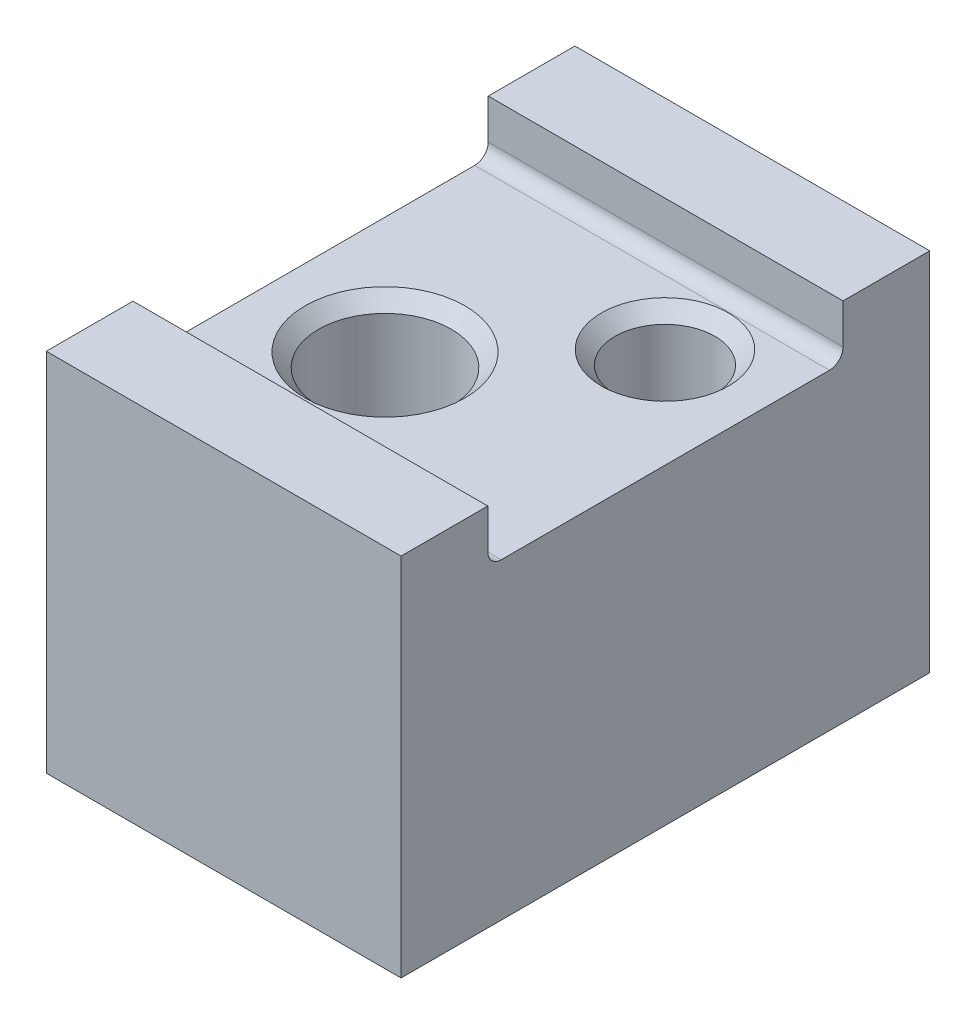
ISO-10303-21;
HEADER;
FILE_DESCRIPTION(('STEP AP214'),'2;1');
FILE_NAME('part.step','',(''),(''),'','','');
FILE_SCHEMA(('AUTOMOTIVE_DESIGN { 1 0 10303 214 1 1 1 1 }'));
ENDSEC;
DATA;
#1=APPLICATION_CONTEXT('core data for automotive mechanical design processes');
#2=APPLICATION_PROTOCOL_DEFINITION('international standard','automotive_design',2000,#1);
#3=PRODUCT_CONTEXT('',#1,'mechanical');
#4=PRODUCT('Part','Part','',(#3));
#5=PRODUCT_RELATED_PRODUCT_CATEGORY('part','',(#4));
#6=PRODUCT_DEFINITION_FORMATION('','',#4);
#7=PRODUCT_DEFINITION_CONTEXT('part definition',#1,'design');
#8=PRODUCT_DEFINITION('design','',#6,#7);
#9=PRODUCT_DEFINITION_SHAPE('','',#8);
#10=(LENGTH_UNIT() NAMED_UNIT(*) SI_UNIT(.MILLI.,.METRE.));
#11=(NAMED_UNIT(*) PLANE_ANGLE_UNIT() SI_UNIT($,.RADIAN.));
#12=(NAMED_UNIT(*) SI_UNIT($,.STERADIAN.) SOLID_ANGLE_UNIT());
#13=UNCERTAINTY_MEASURE_WITH_UNIT(LENGTH_MEASURE(1.E-05),#10,'distance_accuracy_value','');
#14=(GEOMETRIC_REPRESENTATION_CONTEXT(3) GLOBAL_UNCERTAINTY_ASSIGNED_CONTEXT((#13)) GLOBAL_UNIT_ASSIGNED_CONTEXT((#10,
#11,#12)) REPRESENTATION_CONTEXT('',''));
#15=CARTESIAN_POINT('',(0.,0.,0.));
#16=DIRECTION('',(0.,0.,1.));
#17=DIRECTION('',(1.,0.,0.));
#18=AXIS2_PLACEMENT_3D('',#15,#16,#17);
#19=CARTESIAN_POINT('',(0.,10.9728,0.));
#20=DIRECTION('',(0.,-1.,0.));
#21=DIRECTION('',(0.,0.,-1.));
#22=AXIS2_PLACEMENT_3D('',#19,#20,#21);
#23=PLANE('',#22);
#24=DIRECTION('',(0.,0.,-1.));
#25=VECTOR('',#24,1.);
#26=CARTESIAN_POINT('',(-3.503806,10.9728,-7.9375));
#27=LINE('',#26,#25);
#28=CARTESIAN_POINT('',(-3.503806,10.9728,7.9375));
#29=VERTEX_POINT('',#28);
#30=CARTESIAN_POINT('',(-3.503806,10.9728,5.334));
#31=VERTEX_POINT('',#30);
#32=EDGE_CURVE('E236',#29,#31,#27,.T.);
#33=ORIENTED_EDGE('',*,*,#32,.F.);
#34=DIRECTION('',(1.,0.,0.));
#35=VECTOR('',#34,1.);
#36=CARTESIAN_POINT('',(0.,10.9728,7.9375));
#37=LINE('',#36,#35);
#38=CARTESIAN_POINT('',(7.1501,10.9728,7.9375));
#39=VERTEX_POINT('',#38);
#40=EDGE_CURVE('E172',#29,#39,#37,.T.);
#41=ORIENTED_EDGE('',*,*,#40,.T.);
#42=DIRECTION('',(0.,0.,-1.));
#43=VECTOR('',#42,1.);
#44=CARTESIAN_POINT('',(7.1501,10.9728,0.));
#45=LINE('',#44,#43);
#46=CARTESIAN_POINT('',(7.1501,10.9728,5.334));
#47=VERTEX_POINT('',#46);
#48=EDGE_CURVE('E174',#39,#47,#45,.T.);
#49=ORIENTED_EDGE('',*,*,#48,.T.);
#50=DIRECTION('',(1.,0.,0.));
#51=VECTOR('',#50,1.);
#52=CARTESIAN_POINT('',(-7.1501,10.9728,5.334));
#53=LINE('',#52,#51);
#54=EDGE_CURVE('E101',#31,#47,#53,.T.);
#55=ORIENTED_EDGE('',*,*,#54,.F.);
#56=EDGE_LOOP('',(#33,#41,#49,#55));
#57=FACE_BOUND('',#56,.T.);
#58=ADVANCED_FACE('F39',(#57),#23,.F.);
#59=CARTESIAN_POINT('',(-7.1501,10.9728,7.9375));
#60=DIRECTION('',(0.,0.,-1.));
#61=DIRECTION('',(-1.,0.,0.));
#62=AXIS2_PLACEMENT_3D('',#59,#60,#61);
#63=PLANE('',#62);
#64=DIRECTION('',(0.,1.,0.));
#65=VECTOR('',#64,1.);
#66=CARTESIAN_POINT('',(-3.503806,0.,7.9375));
#67=LINE('',#66,#65);
#68=CARTESIAN_POINT('',(-3.503806,0.,7.9375));
#69=VERTEX_POINT('',#68);
#70=EDGE_CURVE('E235',#69,#29,#67,.T.);
#71=ORIENTED_EDGE('',*,*,#70,.F.);
#72=DIRECTION('',(1.,0.,0.));
#73=VECTOR('',#72,1.);
#74=CARTESIAN_POINT('',(-7.1501,0.,7.9375));
#75=LINE('',#74,#73);
#76=CARTESIAN_POINT('',(7.1501,0.,7.9375));
#77=VERTEX_POINT('',#76);
#78=EDGE_CURVE('E93',#69,#77,#75,.T.);
#79=ORIENTED_EDGE('',*,*,#78,.T.);
#80=DIRECTION('',(0.,-1.,0.));
#81=VECTOR('',#80,1.);
#82=CARTESIAN_POINT('',(7.1501,10.9728,7.9375));
#83=LINE('',#82,#81);
#84=EDGE_CURVE('E175',#39,#77,#83,.T.);
#85=ORIENTED_EDGE('',*,*,#84,.F.);
#86=ORIENTED_EDGE('',*,*,#40,.F.);
#87=EDGE_LOOP('',(#71,#79,#85,#86));
#88=FACE_BOUND('',#87,.T.);
#89=ADVANCED_FACE('F292',(#88),#63,.F.);
#90=DIRECTION('',(0.,0.,-1.));
#91=VECTOR('',#90,1.);
#92=CARTESIAN_POINT('',(-3.503806,10.9728,-7.9375));
#93=LINE('',#92,#91);
#94=CARTESIAN_POINT('',(-3.503806,10.9728,-5.334));
#95=VERTEX_POINT('',#94);
#96=CARTESIAN_POINT('',(-3.503806,10.9728,-7.9375));
#97=VERTEX_POINT('',#96);
#98=EDGE_CURVE('E198',#95,#97,#93,.T.);
#99=ORIENTED_EDGE('',*,*,#98,.F.);
#100=DIRECTION('',(1.,0.,0.));
#101=VECTOR('',#100,1.);
#102=CARTESIAN_POINT('',(-7.1501,10.9728,-5.334));
#103=LINE('',#102,#101);
#104=CARTESIAN_POINT('',(7.1501,10.9728,-5.334));
#105=VERTEX_POINT('',#104);
#106=EDGE_CURVE('E111',#95,#105,#103,.T.);
#107=ORIENTED_EDGE('',*,*,#106,.T.);
#108=DIRECTION('',(0.,0.,-1.));
#109=VECTOR('',#108,1.);
#110=CARTESIAN_POINT('',(7.1501,10.9728,0.));
#111=LINE('',#110,#109);
#112=CARTESIAN_POINT('',(7.1501,10.9728,-7.9375));
#113=VERTEX_POINT('',#112);
#114=EDGE_CURVE('E85',#105,#113,#111,.T.);
#115=ORIENTED_EDGE('',*,*,#114,.T.);
#116=DIRECTION('',(1.,0.,0.));
#117=VECTOR('',#116,1.);
#118=CARTESIAN_POINT('',(0.,10.9728,-7.9375));
#119=LINE('',#118,#117);
#120=EDGE_CURVE('E42',#113,#97,#119,.F.);
#121=ORIENTED_EDGE('',*,*,#120,.T.);
#122=EDGE_LOOP('',(#99,#107,#115,#121));
#123=FACE_BOUND('',#122,.T.);
#124=ADVANCED_FACE('F242',(#123),#23,.F.);
#125=CARTESIAN_POINT('',(0.,0.,0.));
#126=DIRECTION('',(0.,-1.,0.));
#127=DIRECTION('',(0.,0.,-1.));
#128=AXIS2_PLACEMENT_3D('',#125,#126,#127);
#129=PLANE('',#128);
#130=CARTESIAN_POINT('',(4.1402,0.,-2.9972));
#131=DIRECTION('',(0.,1.,0.));
#132=DIRECTION('',(0.,0.,1.));
#133=AXIS2_PLACEMENT_3D('',#130,#131,#132);
#134=CIRCLE('',#133,1.5);
#135=CARTESIAN_POINT('',(4.1402,0.,-1.4972));
#136=VERTEX_POINT('',#135);
#137=EDGE_CURVE('E213',#136,#136,#134,.T.);
#138=ORIENTED_EDGE('',*,*,#137,.T.);
#139=EDGE_LOOP('',(#138));
#140=FACE_BOUND('',#139,.T.);
#141=CARTESIAN_POINT('',(0.,0.,1.27));
#142=DIRECTION('',(0.,-1.,0.));
#143=DIRECTION('',(0.,0.,-1.));
#144=AXIS2_PLACEMENT_3D('',#141,#142,#143);
#145=CIRCLE('',#144,1.4986);
#146=CARTESIAN_POINT('',(0.,0.,-0.228599999999999));
#147=VERTEX_POINT('',#146);
#148=EDGE_CURVE('E215',#147,#147,#145,.T.);
#149=ORIENTED_EDGE('',*,*,#148,.F.);
#150=EDGE_LOOP('',(#149));
#151=FACE_BOUND('',#150,.T.);
#152=ORIENTED_EDGE('',*,*,#78,.F.);
#153=DIRECTION('',(0.,0.,-1.));
#154=VECTOR('',#153,1.);
#155=CARTESIAN_POINT('',(-3.503806,0.,-7.9375));
#156=LINE('',#155,#154);
#157=CARTESIAN_POINT('',(-3.503806,0.,-7.9375));
#158=VERTEX_POINT('',#157);
#159=EDGE_CURVE('E234',#69,#158,#156,.T.);
#160=ORIENTED_EDGE('',*,*,#159,.T.);
#161=DIRECTION('',(-1.,0.,0.));
#162=VECTOR('',#161,1.);
#163=CARTESIAN_POINT('',(-7.1501,0.,-7.9375));
#164=LINE('',#163,#162);
#165=CARTESIAN_POINT('',(7.1501,0.,-7.9375));
#166=VERTEX_POINT('',#165);
#167=EDGE_CURVE('E254',#166,#158,#164,.T.);
#168=ORIENTED_EDGE('',*,*,#167,.F.);
#169=DIRECTION('',(0.,0.,-1.));
#170=VECTOR('',#169,1.);
#171=CARTESIAN_POINT('',(7.1501,0.,7.9375));
#172=LINE('',#171,#170);
#173=EDGE_CURVE('E171',#77,#166,#172,.T.);
#174=ORIENTED_EDGE('',*,*,#173,.F.);
#175=EDGE_LOOP('',(#152,#160,#168,#174));
#176=FACE_BOUND('',#175,.T.);
#177=ADVANCED_FACE('F305',(#140,#151,#176),#129,.T.);
#178=CARTESIAN_POINT('',(7.1501,10.9728,7.9375));
#179=DIRECTION('',(-1.,0.,0.));
#180=DIRECTION('',(0.,0.,1.));
#181=AXIS2_PLACEMENT_3D('',#178,#179,#180);
#182=PLANE('',#181);
#183=DIRECTION('',(0.,-1.,0.));
#184=VECTOR('',#183,1.);
#185=CARTESIAN_POINT('',(7.1501,10.9728,5.334));
#186=LINE('',#185,#184);
#187=CARTESIAN_POINT('',(7.1501,9.779,5.334));
#188=VERTEX_POINT('',#187);
#189=EDGE_CURVE('E164',#47,#188,#186,.T.);
#190=ORIENTED_EDGE('',*,*,#189,.F.);
#191=ORIENTED_EDGE('',*,*,#48,.F.);
#192=ORIENTED_EDGE('',*,*,#84,.T.);
#193=ORIENTED_EDGE('',*,*,#173,.T.);
#194=DIRECTION('',(0.,-1.,0.));
#195=VECTOR('',#194,1.);
#196=CARTESIAN_POINT('',(7.1501,10.9728,-7.9375));
#197=LINE('',#196,#195);
#198=EDGE_CURVE('E49',#113,#166,#197,.T.);
#199=ORIENTED_EDGE('',*,*,#198,.F.);
#200=ORIENTED_EDGE('',*,*,#114,.F.);
#201=DIRECTION('',(0.,1.,0.));
#202=VECTOR('',#201,1.);
#203=CARTESIAN_POINT('',(7.1501,10.9728,-5.334));
#204=LINE('',#203,#202);
#205=CARTESIAN_POINT('',(7.1501,9.779,-5.334));
#206=VERTEX_POINT('',#205);
#207=EDGE_CURVE('E153',#206,#105,#204,.T.);
#208=ORIENTED_EDGE('',*,*,#207,.F.);
#209=CARTESIAN_POINT('',(7.150112,9.779,-4.9276));
#210=DIRECTION('',(1.,0.,0.));
#211=DIRECTION('',(0.,-1.,0.));
#212=AXIS2_PLACEMENT_3D('',#209,#210,#211);
#213=CIRCLE('',#212,0.406399999999999);
#214=CARTESIAN_POINT('',(7.150106,9.3726,-4.9276));
#215=VERTEX_POINT('',#214);
#216=EDGE_CURVE('E158',#215,#206,#213,.T.);
#217=ORIENTED_EDGE('',*,*,#216,.F.);
#218=DIRECTION('',(0.,0.,-1.));
#219=VECTOR('',#218,1.);
#220=CARTESIAN_POINT('',(7.1501,9.3726,4.9276));
#221=LINE('',#220,#219);
#222=CARTESIAN_POINT('',(7.150106,9.3726,4.9276));
#223=VERTEX_POINT('',#222);
#224=EDGE_CURVE('E140',#223,#215,#221,.T.);
#225=ORIENTED_EDGE('',*,*,#224,.F.);
#226=CARTESIAN_POINT('',(7.150112,9.779,4.9276));
#227=DIRECTION('',(1.,0.,0.));
#228=DIRECTION('',(0.,0.,1.));
#229=AXIS2_PLACEMENT_3D('',#226,#227,#228);
#230=CIRCLE('',#229,0.406399999999999);
#231=EDGE_CURVE('E143',#188,#223,#230,.T.);
#232=ORIENTED_EDGE('',*,*,#231,.F.);
#233=EDGE_LOOP('',(#190,#191,#192,#193,#199,#200,#208,#217,#225,#232));
#234=FACE_BOUND('',#233,.T.);
#235=ADVANCED_FACE('F41',(#234),#182,.F.);
#236=CARTESIAN_POINT('',(-7.1501,10.9728,-7.9375));
#237=DIRECTION('',(0.,0.,1.));
#238=DIRECTION('',(1.,0.,0.));
#239=AXIS2_PLACEMENT_3D('',#236,#237,#238);
#240=PLANE('',#239);
#241=ORIENTED_EDGE('',*,*,#167,.T.);
#242=DIRECTION('',(0.,1.,0.));
#243=VECTOR('',#242,1.);
#244=CARTESIAN_POINT('',(-3.503806,0.,-7.9375));
#245=LINE('',#244,#243);
#246=EDGE_CURVE('E230',#158,#97,#245,.T.);
#247=ORIENTED_EDGE('',*,*,#246,.T.);
#248=ORIENTED_EDGE('',*,*,#120,.F.);
#249=ORIENTED_EDGE('',*,*,#198,.T.);
#250=EDGE_LOOP('',(#241,#247,#248,#249));
#251=FACE_BOUND('',#250,.T.);
#252=ADVANCED_FACE('F247',(#251),#240,.F.);
#253=CARTESIAN_POINT('',(-7.1501,10.9728,5.334));
#254=DIRECTION('',(0.,0.,1.));
#255=DIRECTION('',(1.,0.,0.));
#256=AXIS2_PLACEMENT_3D('',#253,#254,#255);
#257=PLANE('',#256);
#258=DIRECTION('',(1.,0.,0.));
#259=VECTOR('',#258,1.);
#260=CARTESIAN_POINT('',(-7.1501,9.779,5.334));
#261=LINE('',#260,#259);
#262=CARTESIAN_POINT('',(-3.503806,9.779,5.334));
#263=VERTEX_POINT('',#262);
#264=EDGE_CURVE('E145',#263,#188,#261,.T.);
#265=ORIENTED_EDGE('',*,*,#264,.F.);
#266=DIRECTION('',(0.,1.,0.));
#267=VECTOR('',#266,1.);
#268=CARTESIAN_POINT('',(-3.503806,10.9728,5.334));
#269=LINE('',#268,#267);
#270=EDGE_CURVE('E56',#263,#31,#269,.T.);
#271=ORIENTED_EDGE('',*,*,#270,.T.);
#272=ORIENTED_EDGE('',*,*,#54,.T.);
#273=ORIENTED_EDGE('',*,*,#189,.T.);
#274=EDGE_LOOP('',(#265,#271,#272,#273));
#275=FACE_BOUND('',#274,.T.);
#276=ADVANCED_FACE('F286',(#275),#257,.F.);
#277=CARTESIAN_POINT('',(-7.1501,10.9728,-5.334));
#278=DIRECTION('',(0.,0.,-1.));
#279=DIRECTION('',(-1.,0.,0.));
#280=AXIS2_PLACEMENT_3D('',#277,#278,#279);
#281=PLANE('',#280);
#282=ORIENTED_EDGE('',*,*,#106,.F.);
#283=DIRECTION('',(0.,-1.,0.));
#284=VECTOR('',#283,1.);
#285=CARTESIAN_POINT('',(-3.503806,10.9728,-5.334));
#286=LINE('',#285,#284);
#287=CARTESIAN_POINT('',(-3.503806,9.779,-5.334));
#288=VERTEX_POINT('',#287);
#289=EDGE_CURVE('E224',#95,#288,#286,.T.);
#290=ORIENTED_EDGE('',*,*,#289,.T.);
#291=DIRECTION('',(1.,0.,0.));
#292=VECTOR('',#291,1.);
#293=CARTESIAN_POINT('',(-7.1501,9.779,-5.334));
#294=LINE('',#293,#292);
#295=EDGE_CURVE('E177',#288,#206,#294,.T.);
#296=ORIENTED_EDGE('',*,*,#295,.T.);
#297=ORIENTED_EDGE('',*,*,#207,.T.);
#298=EDGE_LOOP('',(#282,#290,#296,#297));
#299=FACE_BOUND('',#298,.T.);
#300=ADVANCED_FACE('F280',(#299),#281,.F.);
#301=CARTESIAN_POINT('',(-7.1501,9.779,-4.9276));
#302=DIRECTION('',(1.,0.,0.));
#303=DIRECTION('',(0.,0.,-1.));
#304=AXIS2_PLACEMENT_3D('',#301,#302,#303);
#305=CYLINDRICAL_SURFACE('',#304,0.4064);
#306=ORIENTED_EDGE('',*,*,#295,.F.);
#307=CARTESIAN_POINT('',(-3.503806,9.779,-4.9276));
#308=DIRECTION('',(1.,0.,0.));
#309=DIRECTION('',(0.,0.,-1.));
#310=AXIS2_PLACEMENT_3D('',#307,#308,#309);
#311=CIRCLE('',#310,0.4064);
#312=CARTESIAN_POINT('',(-3.503806,9.3726,-4.9276));
#313=VERTEX_POINT('',#312);
#314=EDGE_CURVE('E117',#288,#313,#311,.F.);
#315=ORIENTED_EDGE('',*,*,#314,.T.);
#316=DIRECTION('',(1.,0.,0.));
#317=VECTOR('',#316,1.);
#318=CARTESIAN_POINT('',(-7.1501,9.3726,-4.9276));
#319=LINE('',#318,#317);
#320=EDGE_CURVE('E142',#313,#215,#319,.T.);
#321=ORIENTED_EDGE('',*,*,#320,.T.);
#322=ORIENTED_EDGE('',*,*,#216,.T.);
#323=EDGE_LOOP('',(#306,#315,#321,#322));
#324=FACE_BOUND('',#323,.T.);
#325=ADVANCED_FACE('F278',(#324),#305,.F.);
#326=CARTESIAN_POINT('',(-7.1501,9.3726,4.9276));
#327=DIRECTION('',(0.,-1.,0.));
#328=DIRECTION('',(0.,0.,-1.));
#329=AXIS2_PLACEMENT_3D('',#326,#327,#328);
#330=PLANE('',#329);
#331=CARTESIAN_POINT('',(4.1402,9.3726,-2.9972));
#332=DIRECTION('',(0.,1.,0.));
#333=DIRECTION('',(0.,0.,1.));
#334=AXIS2_PLACEMENT_3D('',#331,#332,#333);
#335=CIRCLE('',#334,1.9064);
#336=CARTESIAN_POINT('',(4.1402,9.3726,-1.0908));
#337=VERTEX_POINT('',#336);
#338=EDGE_CURVE('E223',#337,#337,#335,.T.);
#339=ORIENTED_EDGE('',*,*,#338,.F.);
#340=EDGE_LOOP('',(#339));
#341=FACE_BOUND('',#340,.T.);
#342=CARTESIAN_POINT('',(0.,9.3726,1.27));
#343=DIRECTION('',(0.,-1.,0.));
#344=DIRECTION('',(0.,0.,-1.));
#345=AXIS2_PLACEMENT_3D('',#342,#343,#344);
#346=CIRCLE('',#345,2.4003);
#347=CARTESIAN_POINT('',(0.,9.3726,-1.1303));
#348=VERTEX_POINT('',#347);
#349=EDGE_CURVE('E170',#348,#348,#346,.T.);
#350=ORIENTED_EDGE('',*,*,#349,.T.);
#351=EDGE_LOOP('',(#350));
#352=FACE_BOUND('',#351,.T.);
#353=ORIENTED_EDGE('',*,*,#320,.F.);
#354=DIRECTION('',(0.,0.,1.));
#355=VECTOR('',#354,1.);
#356=CARTESIAN_POINT('',(-3.503806,9.3726,4.9276));
#357=LINE('',#356,#355);
#358=CARTESIAN_POINT('',(-3.503806,9.3726,4.9276));
#359=VERTEX_POINT('',#358);
#360=EDGE_CURVE('E137',#313,#359,#357,.T.);
#361=ORIENTED_EDGE('',*,*,#360,.T.);
#362=DIRECTION('',(1.,0.,0.));
#363=VECTOR('',#362,1.);
#364=CARTESIAN_POINT('',(-7.1501,9.3726,4.9276));
#365=LINE('',#364,#363);
#366=EDGE_CURVE('E135',#359,#223,#365,.T.);
#367=ORIENTED_EDGE('',*,*,#366,.T.);
#368=ORIENTED_EDGE('',*,*,#224,.T.);
#369=EDGE_LOOP('',(#353,#361,#367,#368));
#370=FACE_BOUND('',#369,.T.);
#371=ADVANCED_FACE('F132',(#341,#352,#370),#330,.F.);
#372=CARTESIAN_POINT('',(-7.1501,9.779,4.9276));
#373=DIRECTION('',(1.,0.,0.));
#374=DIRECTION('',(0.,0.,-1.));
#375=AXIS2_PLACEMENT_3D('',#372,#373,#374);
#376=CYLINDRICAL_SURFACE('',#375,0.4064);
#377=ORIENTED_EDGE('',*,*,#366,.F.);
#378=CARTESIAN_POINT('',(-3.503806,9.779,4.9276));
#379=DIRECTION('',(1.,0.,0.));
#380=DIRECTION('',(0.,0.,-1.));
#381=AXIS2_PLACEMENT_3D('',#378,#379,#380);
#382=CIRCLE('',#381,0.4064);
#383=EDGE_CURVE('E11',#359,#263,#382,.F.);
#384=ORIENTED_EDGE('',*,*,#383,.T.);
#385=ORIENTED_EDGE('',*,*,#264,.T.);
#386=ORIENTED_EDGE('',*,*,#231,.T.);
#387=EDGE_LOOP('',(#377,#384,#385,#386));
#388=FACE_BOUND('',#387,.T.);
#389=ADVANCED_FACE('F150',(#388),#376,.F.);
#390=CARTESIAN_POINT('',(0.,9.3726,1.27));
#391=DIRECTION('',(0.,1.,0.));
#392=DIRECTION('',(0.,0.,1.));
#393=AXIS2_PLACEMENT_3D('',#390,#391,#392);
#394=CONICAL_SURFACE('',#393,2.4003,0.785398163397454);
#395=CARTESIAN_POINT('',(0.,8.9662,1.27));
#396=DIRECTION('',(0.,-1.,0.));
#397=DIRECTION('',(0.,0.,-1.));
#398=AXIS2_PLACEMENT_3D('',#395,#396,#397);
#399=CIRCLE('',#398,1.9939);
#400=CARTESIAN_POINT('',(0.,8.9662,-0.7239));
#401=VERTEX_POINT('',#400);
#402=EDGE_CURVE('E201',#401,#401,#399,.T.);
#403=ORIENTED_EDGE('',*,*,#402,.T.);
#404=EDGE_LOOP('',(#403));
#405=FACE_BOUND('',#404,.T.);
#406=ORIENTED_EDGE('',*,*,#349,.F.);
#407=EDGE_LOOP('',(#406));
#408=FACE_BOUND('',#407,.T.);
#409=ADVANCED_FACE('F316',(#405,#408),#394,.F.);
#410=CARTESIAN_POINT('',(0.,0.,1.27));
#411=DIRECTION('',(0.,-1.,0.));
#412=DIRECTION('',(0.,0.,-1.));
#413=AXIS2_PLACEMENT_3D('',#410,#411,#412);
#414=CYLINDRICAL_SURFACE('',#413,1.9939);
#415=CARTESIAN_POINT('',(0.,2.2098,1.27));
#416=DIRECTION('',(0.,-1.,0.));
#417=DIRECTION('',(0.,0.,-1.));
#418=AXIS2_PLACEMENT_3D('',#415,#416,#417);
#419=CIRCLE('',#418,1.9939);
#420=CARTESIAN_POINT('',(0.,2.2098,-0.723899999999999));
#421=VERTEX_POINT('',#420);
#422=EDGE_CURVE('E207',#421,#421,#419,.T.);
#423=ORIENTED_EDGE('',*,*,#422,.T.);
#424=EDGE_LOOP('',(#423));
#425=FACE_BOUND('',#424,.T.);
#426=ORIENTED_EDGE('',*,*,#402,.F.);
#427=EDGE_LOOP('',(#426));
#428=FACE_BOUND('',#427,.T.);
#429=ADVANCED_FACE('F321',(#425,#428),#414,.F.);
#430=CARTESIAN_POINT('',(0.,2.2098,1.27));
#431=DIRECTION('',(0.,1.,0.));
#432=DIRECTION('',(0.,0.,1.));
#433=AXIS2_PLACEMENT_3D('',#430,#431,#432);
#434=CONICAL_SURFACE('',#433,1.9939,0.785398163397454);
#435=CARTESIAN_POINT('',(0.,1.71450000000001,1.27));
#436=DIRECTION('',(0.,-1.,0.));
#437=DIRECTION('',(0.,0.,-1.));
#438=AXIS2_PLACEMENT_3D('',#435,#436,#437);
#439=CIRCLE('',#438,1.4986);
#440=CARTESIAN_POINT('',(0.,1.71450000000001,-0.228599999999999));
#441=VERTEX_POINT('',#440);
#442=EDGE_CURVE('E209',#441,#441,#439,.T.);
#443=ORIENTED_EDGE('',*,*,#442,.T.);
#444=EDGE_LOOP('',(#443));
#445=FACE_BOUND('',#444,.T.);
#446=ORIENTED_EDGE('',*,*,#422,.F.);
#447=EDGE_LOOP('',(#446));
#448=FACE_BOUND('',#447,.T.);
#449=ADVANCED_FACE('F327',(#445,#448),#434,.F.);
#450=CARTESIAN_POINT('',(0.,0.,1.27));
#451=DIRECTION('',(0.,-1.,0.));
#452=DIRECTION('',(0.,0.,-1.));
#453=AXIS2_PLACEMENT_3D('',#450,#451,#452);
#454=CYLINDRICAL_SURFACE('',#453,1.4986);
#455=ORIENTED_EDGE('',*,*,#148,.T.);
#456=EDGE_LOOP('',(#455));
#457=FACE_BOUND('',#456,.T.);
#458=ORIENTED_EDGE('',*,*,#442,.F.);
#459=EDGE_LOOP('',(#458));
#460=FACE_BOUND('',#459,.T.);
#461=ADVANCED_FACE('F340',(#457,#460),#454,.F.);
#462=CARTESIAN_POINT('',(4.1402,10.9728,-2.9972));
#463=DIRECTION('',(0.,1.,0.));
#464=DIRECTION('',(0.,0.,1.));
#465=AXIS2_PLACEMENT_3D('',#462,#463,#464);
#466=CYLINDRICAL_SURFACE('',#465,1.5);
#467=CARTESIAN_POINT('',(4.1402,8.9662,-2.9972));
#468=DIRECTION('',(0.,1.,0.));
#469=DIRECTION('',(0.,0.,1.));
#470=AXIS2_PLACEMENT_3D('',#467,#468,#469);
#471=CIRCLE('',#470,1.5);
#472=CARTESIAN_POINT('',(4.1402,8.9662,-1.4972));
#473=VERTEX_POINT('',#472);
#474=EDGE_CURVE('E216',#473,#473,#471,.T.);
#475=ORIENTED_EDGE('',*,*,#474,.T.);
#476=EDGE_LOOP('',(#475));
#477=FACE_BOUND('',#476,.T.);
#478=ORIENTED_EDGE('',*,*,#137,.F.);
#479=EDGE_LOOP('',(#478));
#480=FACE_BOUND('',#479,.T.);
#481=ADVANCED_FACE('F342',(#477,#480),#466,.F.);
#482=CARTESIAN_POINT('',(4.1402,8.9662,-2.9972));
#483=DIRECTION('',(0.,1.,0.));
#484=DIRECTION('',(0.,0.,1.));
#485=AXIS2_PLACEMENT_3D('',#482,#483,#484);
#486=CONICAL_SURFACE('',#485,1.5,0.785398163397453);
#487=ORIENTED_EDGE('',*,*,#338,.T.);
#488=EDGE_LOOP('',(#487));
#489=FACE_BOUND('',#488,.T.);
#490=ORIENTED_EDGE('',*,*,#474,.F.);
#491=EDGE_LOOP('',(#490));
#492=FACE_BOUND('',#491,.T.);
#493=ADVANCED_FACE('F343',(#489,#492),#486,.F.);
#494=CARTESIAN_POINT('',(-3.503806,0.,-7.9375));
#495=DIRECTION('',(1.,0.,0.));
#496=DIRECTION('',(0.,0.,-1.));
#497=AXIS2_PLACEMENT_3D('',#494,#495,#496);
#498=PLANE('',#497);
#499=ORIENTED_EDGE('',*,*,#383,.F.);
#500=ORIENTED_EDGE('',*,*,#360,.F.);
#501=ORIENTED_EDGE('',*,*,#314,.F.);
#502=ORIENTED_EDGE('',*,*,#289,.F.);
#503=ORIENTED_EDGE('',*,*,#98,.T.);
#504=ORIENTED_EDGE('',*,*,#246,.F.);
#505=ORIENTED_EDGE('',*,*,#159,.F.);
#506=ORIENTED_EDGE('',*,*,#70,.T.);
#507=ORIENTED_EDGE('',*,*,#32,.T.);
#508=ORIENTED_EDGE('',*,*,#270,.F.);
#509=EDGE_LOOP('',(#499,#500,#501,#502,#503,#504,#505,#506,#507,#508));
#510=FACE_BOUND('',#509,.T.);
#511=ADVANCED_FACE('F346',(#510),#498,.F.);
#512=CLOSED_SHELL('',(#58,#89,#124,#177,#235,#252,#276,#300,#325,#371,#389,#409,#429,#449,#461,
#481,#493,#511));
#513=MANIFOLD_SOLID_BREP('B2',#512);
#514=ADVANCED_BREP_SHAPE_REPRESENTATION('',(#18,#513),#14);
#515=SHAPE_DEFINITION_REPRESENTATION(#9,#514);
ENDSEC;
END-ISO-10303-21;
